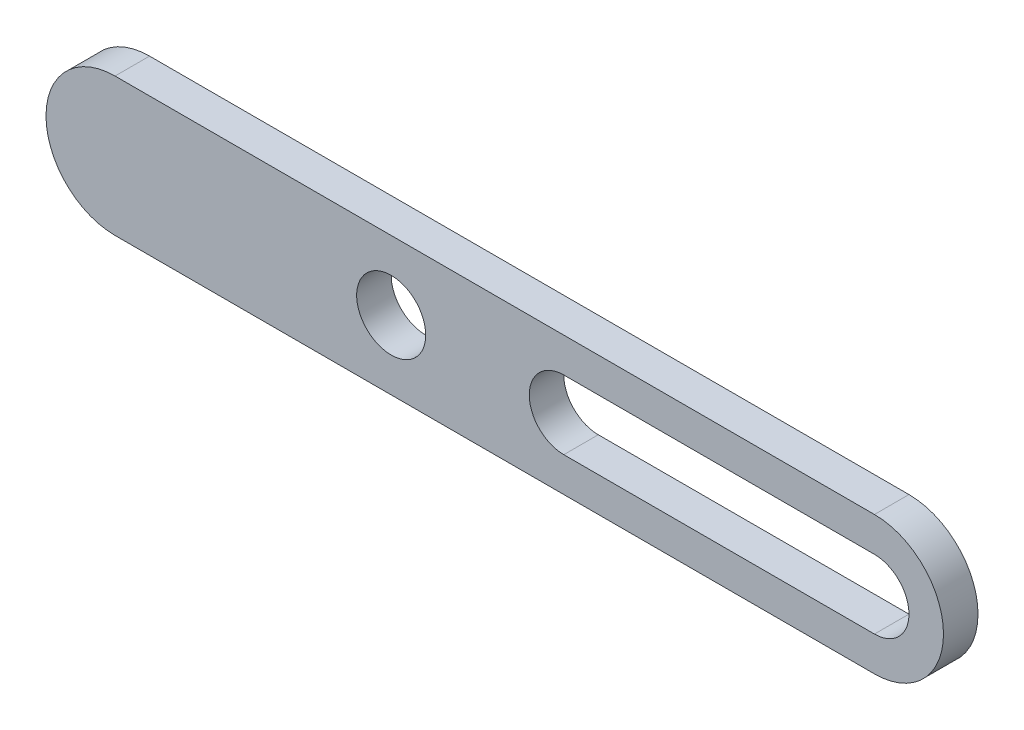
ISO-10303-21;
HEADER;
FILE_DESCRIPTION(('STEP AP214'),'2;1');
FILE_NAME('part.step','',(''),(''),'','','');
FILE_SCHEMA(('AUTOMOTIVE_DESIGN { 1 0 10303 214 1 1 1 1 }'));
ENDSEC;
DATA;
#1=APPLICATION_CONTEXT('core data for automotive mechanical design processes');
#2=APPLICATION_PROTOCOL_DEFINITION('international standard','automotive_design',2000,#1);
#3=PRODUCT_CONTEXT('',#1,'mechanical');
#4=PRODUCT('Part','Part','',(#3));
#5=PRODUCT_RELATED_PRODUCT_CATEGORY('part','',(#4));
#6=PRODUCT_DEFINITION_FORMATION('','',#4);
#7=PRODUCT_DEFINITION_CONTEXT('part definition',#1,'design');
#8=PRODUCT_DEFINITION('design','',#6,#7);
#9=PRODUCT_DEFINITION_SHAPE('','',#8);
#10=(LENGTH_UNIT() NAMED_UNIT(*) SI_UNIT(.MILLI.,.METRE.));
#11=(NAMED_UNIT(*) PLANE_ANGLE_UNIT() SI_UNIT($,.RADIAN.));
#12=(NAMED_UNIT(*) SI_UNIT($,.STERADIAN.) SOLID_ANGLE_UNIT());
#13=UNCERTAINTY_MEASURE_WITH_UNIT(LENGTH_MEASURE(1.E-05),#10,'distance_accuracy_value','');
#14=(GEOMETRIC_REPRESENTATION_CONTEXT(3) GLOBAL_UNCERTAINTY_ASSIGNED_CONTEXT((#13)) GLOBAL_UNIT_ASSIGNED_CONTEXT((#10,
#11,#12)) REPRESENTATION_CONTEXT('',''));
#15=CARTESIAN_POINT('',(0.,0.,0.));
#16=DIRECTION('',(0.,0.,1.));
#17=DIRECTION('',(1.,0.,0.));
#18=AXIS2_PLACEMENT_3D('',#15,#16,#17);
#19=CARTESIAN_POINT('',(88.9,0.,12.7));
#20=DIRECTION('',(0.,0.,-1.));
#21=DIRECTION('',(-1.,0.,0.));
#22=AXIS2_PLACEMENT_3D('',#19,#20,#21);
#23=PLANE('',#22);
#24=CARTESIAN_POINT('',(-88.9,0.,12.7));
#25=DIRECTION('',(0.,0.,1.));
#26=DIRECTION('',(1.,0.,0.));
#27=AXIS2_PLACEMENT_3D('',#24,#25,#26);
#28=CIRCLE('',#27,12.7);
#29=CARTESIAN_POINT('',(-76.2,0.,12.7));
#30=VERTEX_POINT('',#29);
#31=EDGE_CURVE('E138',#30,#30,#28,.T.);
#32=ORIENTED_EDGE('',*,*,#31,.F.);
#33=EDGE_LOOP('',(#32));
#34=FACE_BOUND('',#33,.T.);
#35=CARTESIAN_POINT('',(88.9,0.,12.7));
#36=DIRECTION('',(0.,0.,1.));
#37=DIRECTION('',(-1.,0.,0.));
#38=AXIS2_PLACEMENT_3D('',#35,#36,#37);
#39=CIRCLE('',#38,25.3999999999999);
#40=CARTESIAN_POINT('',(88.9,-25.3999999999999,12.7));
#41=VERTEX_POINT('',#40);
#42=CARTESIAN_POINT('',(88.9,25.4,12.7));
#43=VERTEX_POINT('',#42);
#44=EDGE_CURVE('E144',#41,#43,#39,.T.);
#45=ORIENTED_EDGE('',*,*,#44,.T.);
#46=DIRECTION('',(-1.,0.,0.));
#47=VECTOR('',#46,1.);
#48=CARTESIAN_POINT('',(-88.9,25.4,12.7));
#49=LINE('',#48,#47);
#50=CARTESIAN_POINT('',(-190.5,25.3999999999999,12.7));
#51=VERTEX_POINT('',#50);
#52=EDGE_CURVE('E147',#43,#51,#49,.T.);
#53=ORIENTED_EDGE('',*,*,#52,.T.);
#54=CARTESIAN_POINT('',(-190.5,0.,12.7));
#55=DIRECTION('',(0.,0.,1.));
#56=DIRECTION('',(1.,0.,0.));
#57=AXIS2_PLACEMENT_3D('',#54,#55,#56);
#58=CIRCLE('',#57,25.4);
#59=CARTESIAN_POINT('',(-190.5,-25.4,12.7));
#60=VERTEX_POINT('',#59);
#61=EDGE_CURVE('E150',#51,#60,#58,.T.);
#62=ORIENTED_EDGE('',*,*,#61,.T.);
#63=DIRECTION('',(1.,0.,0.));
#64=VECTOR('',#63,1.);
#65=CARTESIAN_POINT('',(-88.9,-25.4,12.7));
#66=LINE('',#65,#64);
#67=EDGE_CURVE('E152',#60,#41,#66,.T.);
#68=ORIENTED_EDGE('',*,*,#67,.T.);
#69=EDGE_LOOP('',(#45,#53,#62,#68));
#70=FACE_BOUND('',#69,.T.);
#71=CARTESIAN_POINT('',(88.9,0.,12.7));
#72=DIRECTION('',(0.,0.,1.));
#73=DIRECTION('',(1.,0.,0.));
#74=AXIS2_PLACEMENT_3D('',#71,#72,#73);
#75=CIRCLE('',#74,12.7);
#76=CARTESIAN_POINT('',(88.9,-12.7,12.7));
#77=VERTEX_POINT('',#76);
#78=CARTESIAN_POINT('',(88.9,12.7,12.7));
#79=VERTEX_POINT('',#78);
#80=EDGE_CURVE('E102',#77,#79,#75,.T.);
#81=ORIENTED_EDGE('',*,*,#80,.F.);
#82=DIRECTION('',(1.,0.,0.));
#83=VECTOR('',#82,1.);
#84=CARTESIAN_POINT('',(-25.4,-12.7000000000008,12.7));
#85=LINE('',#84,#83);
#86=CARTESIAN_POINT('',(-25.4,-12.7000000000008,12.7));
#87=VERTEX_POINT('',#86);
#88=EDGE_CURVE('E124',#87,#77,#85,.T.);
#89=ORIENTED_EDGE('',*,*,#88,.F.);
#90=CARTESIAN_POINT('',(-25.4,-8.0359618908175E-13,12.7));
#91=DIRECTION('',(0.,0.,1.));
#92=DIRECTION('',(1.,0.,0.));
#93=AXIS2_PLACEMENT_3D('',#90,#91,#92);
#94=CIRCLE('',#93,12.7);
#95=CARTESIAN_POINT('',(-25.4,12.6999999999992,12.7));
#96=VERTEX_POINT('',#95);
#97=EDGE_CURVE('E122',#96,#87,#94,.T.);
#98=ORIENTED_EDGE('',*,*,#97,.F.);
#99=DIRECTION('',(-1.,0.,0.));
#100=VECTOR('',#99,1.);
#101=CARTESIAN_POINT('',(88.9,12.7,12.7));
#102=LINE('',#101,#100);
#103=EDGE_CURVE('E110',#79,#96,#102,.T.);
#104=ORIENTED_EDGE('',*,*,#103,.F.);
#105=EDGE_LOOP('',(#81,#89,#98,#104));
#106=FACE_BOUND('',#105,.T.);
#107=ADVANCED_FACE('F37',(#34,#70,#106),#23,.F.);
#108=CARTESIAN_POINT('',(88.9,0.,0.));
#109=DIRECTION('',(0.,0.,-1.));
#110=DIRECTION('',(-1.,0.,0.));
#111=AXIS2_PLACEMENT_3D('',#108,#109,#110);
#112=PLANE('',#111);
#113=CARTESIAN_POINT('',(88.9,0.,0.));
#114=DIRECTION('',(0.,0.,1.));
#115=DIRECTION('',(-1.,0.,0.));
#116=AXIS2_PLACEMENT_3D('',#113,#114,#115);
#117=CIRCLE('',#116,25.3999999999999);
#118=CARTESIAN_POINT('',(88.9,-25.3999999999999,0.));
#119=VERTEX_POINT('',#118);
#120=CARTESIAN_POINT('',(88.9,25.4,0.));
#121=VERTEX_POINT('',#120);
#122=EDGE_CURVE('E141',#119,#121,#117,.T.);
#123=ORIENTED_EDGE('',*,*,#122,.F.);
#124=DIRECTION('',(1.,0.,0.));
#125=VECTOR('',#124,1.);
#126=CARTESIAN_POINT('',(-88.9,-25.4,0.));
#127=LINE('',#126,#125);
#128=CARTESIAN_POINT('',(-190.5,-25.4,0.));
#129=VERTEX_POINT('',#128);
#130=EDGE_CURVE('E148',#129,#119,#127,.T.);
#131=ORIENTED_EDGE('',*,*,#130,.F.);
#132=CARTESIAN_POINT('',(-190.5,0.,0.));
#133=DIRECTION('',(0.,0.,1.));
#134=DIRECTION('',(1.,0.,0.));
#135=AXIS2_PLACEMENT_3D('',#132,#133,#134);
#136=CIRCLE('',#135,25.4);
#137=CARTESIAN_POINT('',(-190.5,25.3999999999999,0.));
#138=VERTEX_POINT('',#137);
#139=EDGE_CURVE('E159',#138,#129,#136,.T.);
#140=ORIENTED_EDGE('',*,*,#139,.F.);
#141=DIRECTION('',(-1.,0.,0.));
#142=VECTOR('',#141,1.);
#143=CARTESIAN_POINT('',(-88.9,25.4,0.));
#144=LINE('',#143,#142);
#145=EDGE_CURVE('E157',#121,#138,#144,.T.);
#146=ORIENTED_EDGE('',*,*,#145,.F.);
#147=EDGE_LOOP('',(#123,#131,#140,#146));
#148=FACE_BOUND('',#147,.T.);
#149=CARTESIAN_POINT('',(-88.9,0.,0.));
#150=DIRECTION('',(0.,0.,1.));
#151=DIRECTION('',(1.,0.,0.));
#152=AXIS2_PLACEMENT_3D('',#149,#150,#151);
#153=CIRCLE('',#152,12.7);
#154=CARTESIAN_POINT('',(-76.2,0.,0.));
#155=VERTEX_POINT('',#154);
#156=EDGE_CURVE('E118',#155,#155,#153,.T.);
#157=ORIENTED_EDGE('',*,*,#156,.T.);
#158=EDGE_LOOP('',(#157));
#159=FACE_BOUND('',#158,.T.);
#160=DIRECTION('',(1.,0.,0.));
#161=VECTOR('',#160,1.);
#162=CARTESIAN_POINT('',(-25.4,-12.7000000000008,0.));
#163=LINE('',#162,#161);
#164=CARTESIAN_POINT('',(-25.4,-12.7000000000008,0.));
#165=VERTEX_POINT('',#164);
#166=CARTESIAN_POINT('',(88.9,-12.7,0.));
#167=VERTEX_POINT('',#166);
#168=EDGE_CURVE('E111',#165,#167,#163,.T.);
#169=ORIENTED_EDGE('',*,*,#168,.T.);
#170=CARTESIAN_POINT('',(88.9,0.,0.));
#171=DIRECTION('',(0.,0.,1.));
#172=DIRECTION('',(1.,0.,0.));
#173=AXIS2_PLACEMENT_3D('',#170,#171,#172);
#174=CIRCLE('',#173,12.7);
#175=CARTESIAN_POINT('',(88.9,12.7,0.));
#176=VERTEX_POINT('',#175);
#177=EDGE_CURVE('E60',#167,#176,#174,.T.);
#178=ORIENTED_EDGE('',*,*,#177,.T.);
#179=DIRECTION('',(-1.,0.,0.));
#180=VECTOR('',#179,1.);
#181=CARTESIAN_POINT('',(88.9,12.7,0.));
#182=LINE('',#181,#180);
#183=CARTESIAN_POINT('',(-25.4,12.6999999999992,0.));
#184=VERTEX_POINT('',#183);
#185=EDGE_CURVE('E117',#176,#184,#182,.T.);
#186=ORIENTED_EDGE('',*,*,#185,.T.);
#187=CARTESIAN_POINT('',(-25.4,-8.0359618908175E-13,0.));
#188=DIRECTION('',(0.,0.,1.));
#189=DIRECTION('',(1.,0.,0.));
#190=AXIS2_PLACEMENT_3D('',#187,#188,#189);
#191=CIRCLE('',#190,12.7);
#192=EDGE_CURVE('E130',#184,#165,#191,.T.);
#193=ORIENTED_EDGE('',*,*,#192,.T.);
#194=EDGE_LOOP('',(#169,#178,#186,#193));
#195=FACE_BOUND('',#194,.T.);
#196=ADVANCED_FACE('F177',(#148,#159,#195),#112,.T.);
#197=CARTESIAN_POINT('',(88.9,0.,12.7));
#198=DIRECTION('',(0.,0.,-1.));
#199=DIRECTION('',(-1.,0.,0.));
#200=AXIS2_PLACEMENT_3D('',#197,#198,#199);
#201=CYLINDRICAL_SURFACE('',#200,25.3999999999999);
#202=ORIENTED_EDGE('',*,*,#122,.T.);
#203=DIRECTION('',(0.,0.,-1.));
#204=VECTOR('',#203,1.);
#205=CARTESIAN_POINT('',(88.9,25.4,12.7));
#206=LINE('',#205,#204);
#207=EDGE_CURVE('E11',#43,#121,#206,.T.);
#208=ORIENTED_EDGE('',*,*,#207,.F.);
#209=ORIENTED_EDGE('',*,*,#44,.F.);
#210=DIRECTION('',(0.,0.,-1.));
#211=VECTOR('',#210,1.);
#212=CARTESIAN_POINT('',(88.9,-25.3999999999999,12.7));
#213=LINE('',#212,#211);
#214=EDGE_CURVE('E154',#41,#119,#213,.T.);
#215=ORIENTED_EDGE('',*,*,#214,.T.);
#216=EDGE_LOOP('',(#202,#208,#209,#215));
#217=FACE_BOUND('',#216,.T.);
#218=ADVANCED_FACE('F39',(#217),#201,.T.);
#219=CARTESIAN_POINT('',(-88.9,25.4,12.7));
#220=DIRECTION('',(0.,-1.,0.));
#221=DIRECTION('',(1.,0.,0.));
#222=AXIS2_PLACEMENT_3D('',#219,#220,#221);
#223=PLANE('',#222);
#224=ORIENTED_EDGE('',*,*,#145,.T.);
#225=DIRECTION('',(0.,0.,-1.));
#226=VECTOR('',#225,1.);
#227=CARTESIAN_POINT('',(-190.5,25.3999999999999,12.7));
#228=LINE('',#227,#226);
#229=EDGE_CURVE('E45',#51,#138,#228,.T.);
#230=ORIENTED_EDGE('',*,*,#229,.F.);
#231=ORIENTED_EDGE('',*,*,#52,.F.);
#232=ORIENTED_EDGE('',*,*,#207,.T.);
#233=EDGE_LOOP('',(#224,#230,#231,#232));
#234=FACE_BOUND('',#233,.T.);
#235=ADVANCED_FACE('F187',(#234),#223,.F.);
#236=CARTESIAN_POINT('',(-190.5,0.,12.7));
#237=DIRECTION('',(0.,0.,-1.));
#238=DIRECTION('',(-1.,0.,0.));
#239=AXIS2_PLACEMENT_3D('',#236,#237,#238);
#240=CYLINDRICAL_SURFACE('',#239,25.4);
#241=ORIENTED_EDGE('',*,*,#139,.T.);
#242=DIRECTION('',(0.,0.,-1.));
#243=VECTOR('',#242,1.);
#244=CARTESIAN_POINT('',(-190.5,-25.4,12.7));
#245=LINE('',#244,#243);
#246=EDGE_CURVE('E165',#60,#129,#245,.T.);
#247=ORIENTED_EDGE('',*,*,#246,.F.);
#248=ORIENTED_EDGE('',*,*,#61,.F.);
#249=ORIENTED_EDGE('',*,*,#229,.T.);
#250=EDGE_LOOP('',(#241,#247,#248,#249));
#251=FACE_BOUND('',#250,.T.);
#252=ADVANCED_FACE('F172',(#251),#240,.T.);
#253=CARTESIAN_POINT('',(-88.9,-25.4,12.7));
#254=DIRECTION('',(0.,1.,0.));
#255=DIRECTION('',(-1.,0.,0.));
#256=AXIS2_PLACEMENT_3D('',#253,#254,#255);
#257=PLANE('',#256);
#258=ORIENTED_EDGE('',*,*,#130,.T.);
#259=ORIENTED_EDGE('',*,*,#214,.F.);
#260=ORIENTED_EDGE('',*,*,#67,.F.);
#261=ORIENTED_EDGE('',*,*,#246,.T.);
#262=EDGE_LOOP('',(#258,#259,#260,#261));
#263=FACE_BOUND('',#262,.T.);
#264=ADVANCED_FACE('F181',(#263),#257,.F.);
#265=CARTESIAN_POINT('',(-88.9,0.,12.7));
#266=DIRECTION('',(0.,0.,-1.));
#267=DIRECTION('',(-1.,0.,0.));
#268=AXIS2_PLACEMENT_3D('',#265,#266,#267);
#269=CYLINDRICAL_SURFACE('',#268,12.7);
#270=ORIENTED_EDGE('',*,*,#31,.T.);
#271=EDGE_LOOP('',(#270));
#272=FACE_BOUND('',#271,.T.);
#273=ORIENTED_EDGE('',*,*,#156,.F.);
#274=EDGE_LOOP('',(#273));
#275=FACE_BOUND('',#274,.T.);
#276=ADVANCED_FACE('F203',(#272,#275),#269,.F.);
#277=CARTESIAN_POINT('',(88.9,0.,12.7));
#278=DIRECTION('',(0.,0.,-1.));
#279=DIRECTION('',(-1.,0.,0.));
#280=AXIS2_PLACEMENT_3D('',#277,#278,#279);
#281=CYLINDRICAL_SURFACE('',#280,12.7);
#282=ORIENTED_EDGE('',*,*,#177,.F.);
#283=DIRECTION('',(0.,0.,-1.));
#284=VECTOR('',#283,1.);
#285=CARTESIAN_POINT('',(88.9,-12.7,12.7));
#286=LINE('',#285,#284);
#287=EDGE_CURVE('E106',#77,#167,#286,.T.);
#288=ORIENTED_EDGE('',*,*,#287,.F.);
#289=ORIENTED_EDGE('',*,*,#80,.T.);
#290=DIRECTION('',(0.,0.,-1.));
#291=VECTOR('',#290,1.);
#292=CARTESIAN_POINT('',(88.9,12.7,12.7));
#293=LINE('',#292,#291);
#294=EDGE_CURVE('E105',#79,#176,#293,.T.);
#295=ORIENTED_EDGE('',*,*,#294,.T.);
#296=EDGE_LOOP('',(#282,#288,#289,#295));
#297=FACE_BOUND('',#296,.T.);
#298=ADVANCED_FACE('F104',(#297),#281,.F.);
#299=CARTESIAN_POINT('',(88.9,12.7,12.7));
#300=DIRECTION('',(0.,-1.,0.));
#301=DIRECTION('',(1.,0.,0.));
#302=AXIS2_PLACEMENT_3D('',#299,#300,#301);
#303=PLANE('',#302);
#304=ORIENTED_EDGE('',*,*,#185,.F.);
#305=ORIENTED_EDGE('',*,*,#294,.F.);
#306=ORIENTED_EDGE('',*,*,#103,.T.);
#307=DIRECTION('',(0.,0.,-1.));
#308=VECTOR('',#307,1.);
#309=CARTESIAN_POINT('',(-25.4,12.6999999999992,12.7));
#310=LINE('',#309,#308);
#311=EDGE_CURVE('E119',#96,#184,#310,.T.);
#312=ORIENTED_EDGE('',*,*,#311,.T.);
#313=EDGE_LOOP('',(#304,#305,#306,#312));
#314=FACE_BOUND('',#313,.T.);
#315=ADVANCED_FACE('F114',(#314),#303,.T.);
#316=CARTESIAN_POINT('',(-25.4,-8.0359618908175E-13,12.7));
#317=DIRECTION('',(0.,0.,-1.));
#318=DIRECTION('',(-1.,0.,0.));
#319=AXIS2_PLACEMENT_3D('',#316,#317,#318);
#320=CYLINDRICAL_SURFACE('',#319,12.7);
#321=ORIENTED_EDGE('',*,*,#192,.F.);
#322=ORIENTED_EDGE('',*,*,#311,.F.);
#323=ORIENTED_EDGE('',*,*,#97,.T.);
#324=DIRECTION('',(0.,0.,-1.));
#325=VECTOR('',#324,1.);
#326=CARTESIAN_POINT('',(-25.4,-12.7000000000008,12.7));
#327=LINE('',#326,#325);
#328=EDGE_CURVE('E52',#87,#165,#327,.T.);
#329=ORIENTED_EDGE('',*,*,#328,.T.);
#330=EDGE_LOOP('',(#321,#322,#323,#329));
#331=FACE_BOUND('',#330,.T.);
#332=ADVANCED_FACE('F220',(#331),#320,.F.);
#333=CARTESIAN_POINT('',(-25.4,-12.7000000000008,12.7));
#334=DIRECTION('',(0.,1.,0.));
#335=DIRECTION('',(-1.,0.,0.));
#336=AXIS2_PLACEMENT_3D('',#333,#334,#335);
#337=PLANE('',#336);
#338=ORIENTED_EDGE('',*,*,#168,.F.);
#339=ORIENTED_EDGE('',*,*,#328,.F.);
#340=ORIENTED_EDGE('',*,*,#88,.T.);
#341=ORIENTED_EDGE('',*,*,#287,.T.);
#342=EDGE_LOOP('',(#338,#339,#340,#341));
#343=FACE_BOUND('',#342,.T.);
#344=ADVANCED_FACE('F218',(#343),#337,.T.);
#345=CLOSED_SHELL('',(#107,#196,#218,#235,#252,#264,#276,#298,#315,#332,#344));
#346=MANIFOLD_SOLID_BREP('B2',#345);
#347=ADVANCED_BREP_SHAPE_REPRESENTATION('',(#18,#346),#14);
#348=SHAPE_DEFINITION_REPRESENTATION(#9,#347);
ENDSEC;
END-ISO-10303-21;
